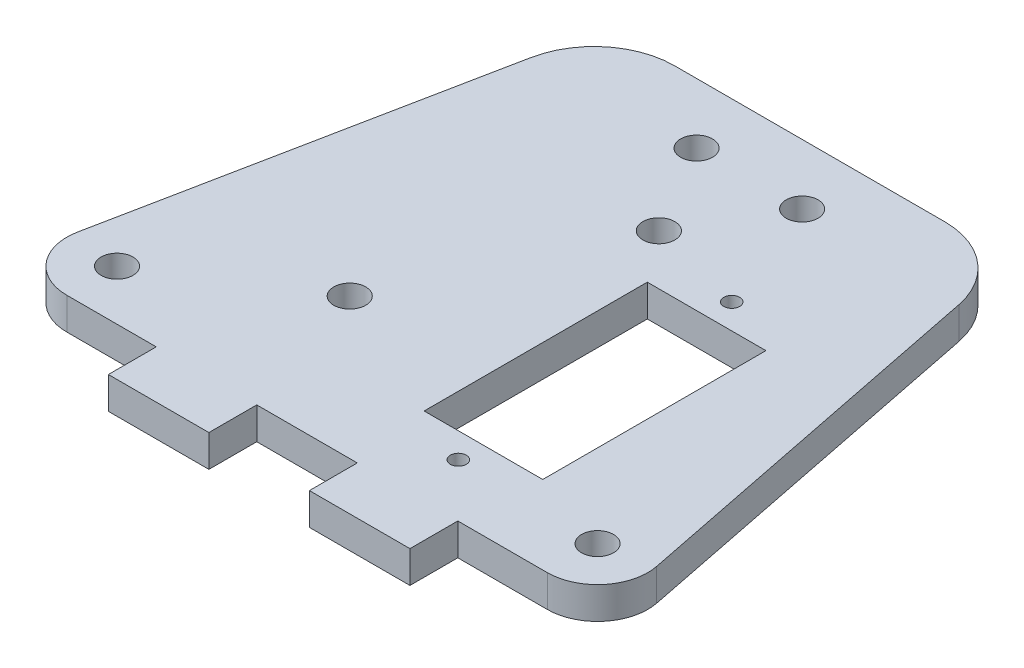
ISO-10303-21;
HEADER;
FILE_DESCRIPTION(('STEP AP214'),'2;1');
FILE_NAME('part.step','',(''),(''),'','','');
FILE_SCHEMA(('AUTOMOTIVE_DESIGN { 1 0 10303 214 1 1 1 1 }'));
ENDSEC;
DATA;
#1=APPLICATION_CONTEXT('core data for automotive mechanical design processes');
#2=APPLICATION_PROTOCOL_DEFINITION('international standard','automotive_design',2000,#1);
#3=PRODUCT_CONTEXT('',#1,'mechanical');
#4=PRODUCT('Part','Part','',(#3));
#5=PRODUCT_RELATED_PRODUCT_CATEGORY('part','',(#4));
#6=PRODUCT_DEFINITION_FORMATION('','',#4);
#7=PRODUCT_DEFINITION_CONTEXT('part definition',#1,'design');
#8=PRODUCT_DEFINITION('design','',#6,#7);
#9=PRODUCT_DEFINITION_SHAPE('','',#8);
#10=(LENGTH_UNIT() NAMED_UNIT(*) SI_UNIT(.MILLI.,.METRE.));
#11=(NAMED_UNIT(*) PLANE_ANGLE_UNIT() SI_UNIT($,.RADIAN.));
#12=(NAMED_UNIT(*) SI_UNIT($,.STERADIAN.) SOLID_ANGLE_UNIT());
#13=UNCERTAINTY_MEASURE_WITH_UNIT(LENGTH_MEASURE(1.E-05),#10,'distance_accuracy_value','');
#14=(GEOMETRIC_REPRESENTATION_CONTEXT(3) GLOBAL_UNCERTAINTY_ASSIGNED_CONTEXT((#13)) GLOBAL_UNIT_ASSIGNED_CONTEXT((#10,
#11,#12)) REPRESENTATION_CONTEXT('',''));
#15=CARTESIAN_POINT('',(0.,0.,0.));
#16=DIRECTION('',(0.,0.,1.));
#17=DIRECTION('',(1.,0.,0.));
#18=AXIS2_PLACEMENT_3D('',#15,#16,#17);
#19=CARTESIAN_POINT('',(0.,3.175,0.));
#20=DIRECTION('',(0.,0.,-1.));
#21=DIRECTION('',(-1.,0.,0.));
#22=AXIS2_PLACEMENT_3D('',#19,#20,#21);
#23=PLANE('',#22);
#24=DIRECTION('',(1.,0.,0.));
#25=VECTOR('',#24,1.);
#26=CARTESIAN_POINT('',(0.,0.,0.));
#27=LINE('',#26,#25);
#28=CARTESIAN_POINT('',(25.0000000000002,0.,0.));
#29=VERTEX_POINT('',#28);
#30=CARTESIAN_POINT('',(35.0000000000002,0.,0.));
#31=VERTEX_POINT('',#30);
#32=EDGE_CURVE('E365',#29,#31,#27,.T.);
#33=ORIENTED_EDGE('',*,*,#32,.T.);
#34=DIRECTION('',(0.,1.,0.));
#35=VECTOR('',#34,1.);
#36=CARTESIAN_POINT('',(35.0000000000002,0.,0.));
#37=LINE('',#36,#35);
#38=CARTESIAN_POINT('',(35.0000000000002,3.175,0.));
#39=VERTEX_POINT('',#38);
#40=EDGE_CURVE('E57',#31,#39,#37,.T.);
#41=ORIENTED_EDGE('',*,*,#40,.T.);
#42=DIRECTION('',(1.,0.,0.));
#43=VECTOR('',#42,1.);
#44=CARTESIAN_POINT('',(0.,3.175,0.));
#45=LINE('',#44,#43);
#46=CARTESIAN_POINT('',(25.0000000000002,3.175,0.));
#47=VERTEX_POINT('',#46);
#48=EDGE_CURVE('E350',#47,#39,#45,.T.);
#49=ORIENTED_EDGE('',*,*,#48,.F.);
#50=DIRECTION('',(0.,1.,0.));
#51=VECTOR('',#50,1.);
#52=CARTESIAN_POINT('',(25.0000000000002,0.,0.));
#53=LINE('',#52,#51);
#54=EDGE_CURVE('E230',#29,#47,#53,.T.);
#55=ORIENTED_EDGE('',*,*,#54,.F.);
#56=EDGE_LOOP('',(#33,#41,#49,#55));
#57=FACE_BOUND('',#56,.T.);
#58=ADVANCED_FACE('F34',(#57),#23,.F.);
#59=CARTESIAN_POINT('',(6.09901951359281,0.,0.));
#60=VERTEX_POINT('',#59);
#61=CARTESIAN_POINT('',(15.0000000000002,0.,0.));
#62=VERTEX_POINT('',#61);
#63=EDGE_CURVE('E363',#60,#62,#27,.T.);
#64=ORIENTED_EDGE('',*,*,#63,.T.);
#65=DIRECTION('',(0.,1.,0.));
#66=VECTOR('',#65,1.);
#67=CARTESIAN_POINT('',(15.0000000000002,0.,0.));
#68=LINE('',#67,#66);
#69=CARTESIAN_POINT('',(15.0000000000002,3.175,0.));
#70=VERTEX_POINT('',#69);
#71=EDGE_CURVE('E227',#62,#70,#68,.T.);
#72=ORIENTED_EDGE('',*,*,#71,.T.);
#73=CARTESIAN_POINT('',(6.09901951359281,3.175,0.));
#74=VERTEX_POINT('',#73);
#75=EDGE_CURVE('E346',#74,#70,#45,.T.);
#76=ORIENTED_EDGE('',*,*,#75,.F.);
#77=DIRECTION('',(0.,1.,0.));
#78=VECTOR('',#77,1.);
#79=CARTESIAN_POINT('',(6.09901951359281,0.,0.));
#80=LINE('',#79,#78);
#81=EDGE_CURVE('E251',#60,#74,#80,.T.);
#82=ORIENTED_EDGE('',*,*,#81,.F.);
#83=EDGE_LOOP('',(#64,#72,#76,#82));
#84=FACE_BOUND('',#83,.T.);
#85=ADVANCED_FACE('F420',(#84),#23,.F.);
#86=CARTESIAN_POINT('',(45.0000000000002,3.175,0.));
#87=VERTEX_POINT('',#86);
#88=CARTESIAN_POINT('',(53.9009804864072,3.175,0.));
#89=VERTEX_POINT('',#88);
#90=EDGE_CURVE('E49',#87,#89,#45,.T.);
#91=ORIENTED_EDGE('',*,*,#90,.F.);
#92=DIRECTION('',(0.,1.,0.));
#93=VECTOR('',#92,1.);
#94=CARTESIAN_POINT('',(45.0000000000002,0.,0.));
#95=LINE('',#94,#93);
#96=CARTESIAN_POINT('',(45.0000000000002,0.,0.));
#97=VERTEX_POINT('',#96);
#98=EDGE_CURVE('E206',#97,#87,#95,.T.);
#99=ORIENTED_EDGE('',*,*,#98,.F.);
#100=CARTESIAN_POINT('',(53.9009804864072,0.,0.));
#101=VERTEX_POINT('',#100);
#102=EDGE_CURVE('E362',#97,#101,#27,.T.);
#103=ORIENTED_EDGE('',*,*,#102,.T.);
#104=DIRECTION('',(0.,1.,0.));
#105=VECTOR('',#104,1.);
#106=CARTESIAN_POINT('',(53.9009804864072,0.,0.));
#107=LINE('',#106,#105);
#108=EDGE_CURVE('E239',#101,#89,#107,.T.);
#109=ORIENTED_EDGE('',*,*,#108,.T.);
#110=EDGE_LOOP('',(#91,#99,#103,#109));
#111=FACE_BOUND('',#110,.T.);
#112=ADVANCED_FACE('F436',(#111),#23,.F.);
#113=CARTESIAN_POINT('',(8.71378581622126,3.175,-43.5689290811055));
#114=DIRECTION('',(0.980580675690919,0.,0.196116135138188));
#115=DIRECTION('',(0.196116135138188,0.,-0.98058067569092));
#116=AXIS2_PLACEMENT_3D('',#113,#114,#115);
#117=PLANE('',#116);
#118=DIRECTION('',(0.,1.,0.));
#119=VECTOR('',#118,1.);
#120=CARTESIAN_POINT('',(1.19611613513821,0.,-5.98058067569094));
#121=LINE('',#120,#119);
#122=CARTESIAN_POINT('',(1.19611613513821,0.,-5.98058067569094));
#123=VERTEX_POINT('',#122);
#124=CARTESIAN_POINT('',(1.19611613513821,3.175,-5.98058067569094));
#125=VERTEX_POINT('',#124);
#126=EDGE_CURVE('E249',#123,#125,#121,.T.);
#127=ORIENTED_EDGE('',*,*,#126,.T.);
#128=DIRECTION('',(-0.196116135138188,0.,0.980580675690919));
#129=VECTOR('',#128,1.);
#130=CARTESIAN_POINT('',(8.71378581622126,3.175,-43.5689290811055));
#131=LINE('',#130,#129);
#132=CARTESIAN_POINT('',(8.71378581622126,3.175,-43.5689290811055));
#133=VERTEX_POINT('',#132);
#134=EDGE_CURVE('E343',#133,#125,#131,.T.);
#135=ORIENTED_EDGE('',*,*,#134,.F.);
#136=DIRECTION('',(0.,-1.,0.));
#137=VECTOR('',#136,1.);
#138=CARTESIAN_POINT('',(8.71378581622126,3.175,-43.5689290811055));
#139=LINE('',#138,#137);
#140=CARTESIAN_POINT('',(8.71378581622126,0.,-43.5689290811055));
#141=VERTEX_POINT('',#140);
#142=EDGE_CURVE('E369',#133,#141,#139,.T.);
#143=ORIENTED_EDGE('',*,*,#142,.T.);
#144=DIRECTION('',(-0.196116135138188,0.,0.980580675690919));
#145=VECTOR('',#144,1.);
#146=CARTESIAN_POINT('',(8.71378581622126,0.,-43.5689290811055));
#147=LINE('',#146,#145);
#148=EDGE_CURVE('E359',#141,#123,#147,.T.);
#149=ORIENTED_EDGE('',*,*,#148,.T.);
#150=EDGE_LOOP('',(#127,#135,#143,#149));
#151=FACE_BOUND('',#150,.T.);
#152=ADVANCED_FACE('F383',(#151),#117,.F.);
#153=CARTESIAN_POINT('',(43.4415687782517,3.175,-42.));
#154=DIRECTION('',(0.,1.,0.));
#155=DIRECTION('',(0.,0.,1.));
#156=AXIS2_PLACEMENT_3D('',#153,#154,#155);
#157=PLANE('',#156);
#158=CARTESIAN_POINT('',(53.9009804864072,3.175,-5.));
#159=DIRECTION('',(0.,-1.,0.));
#160=DIRECTION('',(0.,0.,1.));
#161=AXIS2_PLACEMENT_3D('',#158,#159,#160);
#162=CIRCLE('',#161,5.);
#163=CARTESIAN_POINT('',(58.8038838648618,3.175,-5.9805806756909));
#164=VERTEX_POINT('',#163);
#165=EDGE_CURVE('E229',#164,#89,#162,.T.);
#166=ORIENTED_EDGE('',*,*,#165,.F.);
#167=DIRECTION('',(-0.19611613513818,0.,-0.980580675690921));
#168=VECTOR('',#167,1.);
#169=CARTESIAN_POINT('',(51.2862141837791,3.175,-43.5689290811054));
#170=LINE('',#169,#168);
#171=CARTESIAN_POINT('',(51.2862141837791,3.175,-43.5689290811054));
#172=VERTEX_POINT('',#171);
#173=EDGE_CURVE('E349',#164,#172,#170,.T.);
#174=ORIENTED_EDGE('',*,*,#173,.T.);
#175=CARTESIAN_POINT('',(43.4415687782517,3.175,-42.));
#176=DIRECTION('',(0.,1.,0.));
#177=DIRECTION('',(0.,0.,1.));
#178=AXIS2_PLACEMENT_3D('',#175,#176,#177);
#179=CIRCLE('',#178,8.);
#180=CARTESIAN_POINT('',(43.4415687782517,3.175,-50.));
#181=VERTEX_POINT('',#180);
#182=EDGE_CURVE('E335',#172,#181,#179,.T.);
#183=ORIENTED_EDGE('',*,*,#182,.T.);
#184=DIRECTION('',(-1.,0.,0.));
#185=VECTOR('',#184,1.);
#186=CARTESIAN_POINT('',(16.5584312217487,3.175,-50.));
#187=LINE('',#186,#185);
#188=CARTESIAN_POINT('',(16.5584312217487,3.175,-50.));
#189=VERTEX_POINT('',#188);
#190=EDGE_CURVE('E338',#181,#189,#187,.T.);
#191=ORIENTED_EDGE('',*,*,#190,.T.);
#192=CARTESIAN_POINT('',(16.5584312217486,3.175,-42.));
#193=DIRECTION('',(0.,1.,0.));
#194=DIRECTION('',(0.,0.,-1.));
#195=AXIS2_PLACEMENT_3D('',#192,#193,#194);
#196=CIRCLE('',#195,8.);
#197=EDGE_CURVE('E341',#189,#133,#196,.T.);
#198=ORIENTED_EDGE('',*,*,#197,.T.);
#199=ORIENTED_EDGE('',*,*,#134,.T.);
#200=CARTESIAN_POINT('',(6.09901951359281,3.175,-5.));
#201=DIRECTION('',(0.,-1.,0.));
#202=DIRECTION('',(0.,0.,1.));
#203=AXIS2_PLACEMENT_3D('',#200,#201,#202);
#204=CIRCLE('',#203,5.);
#205=EDGE_CURVE('E244',#74,#125,#204,.T.);
#206=ORIENTED_EDGE('',*,*,#205,.F.);
#207=ORIENTED_EDGE('',*,*,#75,.T.);
#208=DIRECTION('',(0.,0.,1.));
#209=VECTOR('',#208,1.);
#210=CARTESIAN_POINT('',(15.0000000000002,3.175,0.));
#211=LINE('',#210,#209);
#212=CARTESIAN_POINT('',(15.0000000000002,3.175,4.7625));
#213=VERTEX_POINT('',#212);
#214=EDGE_CURVE('E205',#70,#213,#211,.T.);
#215=ORIENTED_EDGE('',*,*,#214,.T.);
#216=DIRECTION('',(1.,0.,0.));
#217=VECTOR('',#216,1.);
#218=CARTESIAN_POINT('',(15.0000000000002,3.175,4.7625));
#219=LINE('',#218,#217);
#220=CARTESIAN_POINT('',(25.0000000000002,3.175,4.7625));
#221=VERTEX_POINT('',#220);
#222=EDGE_CURVE('E222',#213,#221,#219,.T.);
#223=ORIENTED_EDGE('',*,*,#222,.T.);
#224=DIRECTION('',(0.,0.,-1.));
#225=VECTOR('',#224,1.);
#226=CARTESIAN_POINT('',(25.0000000000002,3.175,0.));
#227=LINE('',#226,#225);
#228=EDGE_CURVE('E213',#221,#47,#227,.T.);
#229=ORIENTED_EDGE('',*,*,#228,.T.);
#230=ORIENTED_EDGE('',*,*,#48,.T.);
#231=DIRECTION('',(0.,0.,1.));
#232=VECTOR('',#231,1.);
#233=CARTESIAN_POINT('',(35.0000000000002,3.175,0.));
#234=LINE('',#233,#232);
#235=CARTESIAN_POINT('',(35.0000000000002,3.175,4.7625));
#236=VERTEX_POINT('',#235);
#237=EDGE_CURVE('E201',#39,#236,#234,.T.);
#238=ORIENTED_EDGE('',*,*,#237,.T.);
#239=DIRECTION('',(1.,0.,0.));
#240=VECTOR('',#239,1.);
#241=CARTESIAN_POINT('',(35.0000000000002,3.175,4.7625));
#242=LINE('',#241,#240);
#243=CARTESIAN_POINT('',(45.0000000000002,3.175,4.7625));
#244=VERTEX_POINT('',#243);
#245=EDGE_CURVE('E177',#236,#244,#242,.T.);
#246=ORIENTED_EDGE('',*,*,#245,.T.);
#247=DIRECTION('',(0.,0.,-1.));
#248=VECTOR('',#247,1.);
#249=CARTESIAN_POINT('',(45.0000000000002,3.175,0.));
#250=LINE('',#249,#248);
#251=EDGE_CURVE('E195',#244,#87,#250,.T.);
#252=ORIENTED_EDGE('',*,*,#251,.T.);
#253=ORIENTED_EDGE('',*,*,#90,.T.);
#254=EDGE_LOOP('',(#166,#174,#183,#191,#198,#199,#206,#207,#215,#223,#229,#230,#238,#246,#252,#253));
#255=FACE_BOUND('',#254,.T.);
#256=CARTESIAN_POINT('',(53.9009804864072,3.175,-5.));
#257=DIRECTION('',(0.,1.,0.));
#258=DIRECTION('',(0.,0.,1.));
#259=AXIS2_PLACEMENT_3D('',#256,#257,#258);
#260=CIRCLE('',#259,1.5875);
#261=CARTESIAN_POINT('',(53.9009804864072,3.175,-3.4125));
#262=VERTEX_POINT('',#261);
#263=EDGE_CURVE('E253',#262,#262,#260,.T.);
#264=ORIENTED_EDGE('',*,*,#263,.F.);
#265=EDGE_LOOP('',(#264));
#266=FACE_BOUND('',#265,.T.);
#267=CARTESIAN_POINT('',(6.09901951359281,3.175,-5.));
#268=DIRECTION('',(0.,1.,0.));
#269=DIRECTION('',(0.,0.,1.));
#270=AXIS2_PLACEMENT_3D('',#267,#268,#269);
#271=CIRCLE('',#270,1.5875);
#272=CARTESIAN_POINT('',(6.09901951359281,3.175,-3.4125));
#273=VERTEX_POINT('',#272);
#274=EDGE_CURVE('E259',#273,#273,#271,.T.);
#275=ORIENTED_EDGE('',*,*,#274,.F.);
#276=EDGE_LOOP('',(#275));
#277=FACE_BOUND('',#276,.T.);
#278=CARTESIAN_POINT('',(30.,3.175,-35.));
#279=DIRECTION('',(0.,1.,0.));
#280=DIRECTION('',(0.,0.,1.));
#281=AXIS2_PLACEMENT_3D('',#278,#279,#280);
#282=CIRCLE('',#281,1.5875);
#283=CARTESIAN_POINT('',(30.,3.175,-33.4125));
#284=VERTEX_POINT('',#283);
#285=EDGE_CURVE('E265',#284,#284,#282,.T.);
#286=ORIENTED_EDGE('',*,*,#285,.F.);
#287=EDGE_LOOP('',(#286));
#288=FACE_BOUND('',#287,.T.);
#289=CARTESIAN_POINT('',(24.75,3.175,-44.));
#290=DIRECTION('',(0.,1.,0.));
#291=DIRECTION('',(0.,0.,1.));
#292=AXIS2_PLACEMENT_3D('',#289,#290,#291);
#293=CIRCLE('',#292,1.5875);
#294=CARTESIAN_POINT('',(24.75,3.175,-42.4125));
#295=VERTEX_POINT('',#294);
#296=EDGE_CURVE('E280',#295,#295,#293,.T.);
#297=ORIENTED_EDGE('',*,*,#296,.F.);
#298=EDGE_LOOP('',(#297));
#299=FACE_BOUND('',#298,.T.);
#300=CARTESIAN_POINT('',(39.75,3.175,-32.5));
#301=DIRECTION('',(0.,1.,0.));
#302=DIRECTION('',(0.,0.,1.));
#303=AXIS2_PLACEMENT_3D('',#300,#301,#302);
#304=CIRCLE('',#303,0.793749999999999);
#305=CARTESIAN_POINT('',(39.75,3.175,-31.70625));
#306=VERTEX_POINT('',#305);
#307=EDGE_CURVE('E292',#306,#306,#304,.T.);
#308=ORIENTED_EDGE('',*,*,#307,.F.);
#309=EDGE_LOOP('',(#308));
#310=FACE_BOUND('',#309,.T.);
#311=DIRECTION('',(1.,0.,0.));
#312=VECTOR('',#311,1.);
#313=CARTESIAN_POINT('',(45.65,3.175,-7.79999999999999));
#314=LINE('',#313,#312);
#315=CARTESIAN_POINT('',(33.85,3.175,-7.79999999999999));
#316=VERTEX_POINT('',#315);
#317=CARTESIAN_POINT('',(45.65,3.175,-7.79999999999999));
#318=VERTEX_POINT('',#317);
#319=EDGE_CURVE('E306',#316,#318,#314,.T.);
#320=ORIENTED_EDGE('',*,*,#319,.F.);
#321=DIRECTION('',(0.,0.,1.));
#322=VECTOR('',#321,1.);
#323=CARTESIAN_POINT('',(33.85,3.175,-30.));
#324=LINE('',#323,#322);
#325=CARTESIAN_POINT('',(33.85,3.175,-30.));
#326=VERTEX_POINT('',#325);
#327=EDGE_CURVE('E304',#326,#316,#324,.T.);
#328=ORIENTED_EDGE('',*,*,#327,.F.);
#329=DIRECTION('',(-1.,0.,0.));
#330=VECTOR('',#329,1.);
#331=CARTESIAN_POINT('',(33.85,3.175,-30.));
#332=LINE('',#331,#330);
#333=CARTESIAN_POINT('',(45.65,3.175,-30.));
#334=VERTEX_POINT('',#333);
#335=EDGE_CURVE('E312',#334,#326,#332,.T.);
#336=ORIENTED_EDGE('',*,*,#335,.F.);
#337=DIRECTION('',(0.,0.,-1.));
#338=VECTOR('',#337,1.);
#339=CARTESIAN_POINT('',(45.65,3.175,-30.));
#340=LINE('',#339,#338);
#341=EDGE_CURVE('E309',#318,#334,#340,.T.);
#342=ORIENTED_EDGE('',*,*,#341,.F.);
#343=EDGE_LOOP('',(#320,#328,#336,#342));
#344=FACE_BOUND('',#343,.T.);
#345=CARTESIAN_POINT('',(39.75,3.175,-5.29999999999999));
#346=DIRECTION('',(0.,1.,0.));
#347=DIRECTION('',(0.,0.,1.));
#348=AXIS2_PLACEMENT_3D('',#345,#346,#347);
#349=CIRCLE('',#348,0.79375);
#350=CARTESIAN_POINT('',(39.75,3.175,-4.50624999999999));
#351=VERTEX_POINT('',#350);
#352=EDGE_CURVE('E298',#351,#351,#349,.T.);
#353=ORIENTED_EDGE('',*,*,#352,.F.);
#354=EDGE_LOOP('',(#353));
#355=FACE_BOUND('',#354,.T.);
#356=CARTESIAN_POINT('',(20.25,3.175,-14.));
#357=DIRECTION('',(0.,1.,0.));
#358=DIRECTION('',(0.,0.,1.));
#359=AXIS2_PLACEMENT_3D('',#356,#357,#358);
#360=CIRCLE('',#359,1.5875);
#361=CARTESIAN_POINT('',(20.25,3.175,-12.4125));
#362=VERTEX_POINT('',#361);
#363=EDGE_CURVE('E286',#362,#362,#360,.T.);
#364=ORIENTED_EDGE('',*,*,#363,.F.);
#365=EDGE_LOOP('',(#364));
#366=FACE_BOUND('',#365,.T.);
#367=CARTESIAN_POINT('',(35.25,3.175,-44.));
#368=DIRECTION('',(0.,1.,0.));
#369=DIRECTION('',(0.,0.,1.));
#370=AXIS2_PLACEMENT_3D('',#367,#368,#369);
#371=CIRCLE('',#370,1.5875);
#372=CARTESIAN_POINT('',(35.25,3.175,-42.4125));
#373=VERTEX_POINT('',#372);
#374=EDGE_CURVE('E274',#373,#373,#371,.T.);
#375=ORIENTED_EDGE('',*,*,#374,.F.);
#376=EDGE_LOOP('',(#375));
#377=FACE_BOUND('',#376,.T.);
#378=ADVANCED_FACE('F388',(#255,#266,#277,#288,#299,#310,#344,#355,#366,#377),#157,.T.);
#379=CARTESIAN_POINT('',(43.4415687782517,0.,-42.));
#380=DIRECTION('',(0.,1.,0.));
#381=DIRECTION('',(0.,0.,1.));
#382=AXIS2_PLACEMENT_3D('',#379,#380,#381);
#383=PLANE('',#382);
#384=CARTESIAN_POINT('',(53.9009804864072,0.,-5.));
#385=DIRECTION('',(0.,1.,0.));
#386=DIRECTION('',(0.,0.,1.));
#387=AXIS2_PLACEMENT_3D('',#384,#385,#386);
#388=CIRCLE('',#387,1.5875);
#389=CARTESIAN_POINT('',(53.9009804864072,0.,-3.4125));
#390=VERTEX_POINT('',#389);
#391=EDGE_CURVE('E256',#390,#390,#388,.T.);
#392=ORIENTED_EDGE('',*,*,#391,.T.);
#393=EDGE_LOOP('',(#392));
#394=FACE_BOUND('',#393,.T.);
#395=CARTESIAN_POINT('',(6.09901951359281,0.,-5.));
#396=DIRECTION('',(0.,1.,0.));
#397=DIRECTION('',(0.,0.,1.));
#398=AXIS2_PLACEMENT_3D('',#395,#396,#397);
#399=CIRCLE('',#398,1.5875);
#400=CARTESIAN_POINT('',(6.09901951359281,0.,-3.4125));
#401=VERTEX_POINT('',#400);
#402=EDGE_CURVE('E262',#401,#401,#399,.T.);
#403=ORIENTED_EDGE('',*,*,#402,.T.);
#404=EDGE_LOOP('',(#403));
#405=FACE_BOUND('',#404,.T.);
#406=CARTESIAN_POINT('',(30.,0.,-35.));
#407=DIRECTION('',(0.,1.,0.));
#408=DIRECTION('',(0.,0.,1.));
#409=AXIS2_PLACEMENT_3D('',#406,#407,#408);
#410=CIRCLE('',#409,1.5875);
#411=CARTESIAN_POINT('',(30.,0.,-33.4125));
#412=VERTEX_POINT('',#411);
#413=EDGE_CURVE('E268',#412,#412,#410,.T.);
#414=ORIENTED_EDGE('',*,*,#413,.T.);
#415=EDGE_LOOP('',(#414));
#416=FACE_BOUND('',#415,.T.);
#417=CARTESIAN_POINT('',(24.75,0.,-44.));
#418=DIRECTION('',(0.,1.,0.));
#419=DIRECTION('',(0.,0.,1.));
#420=AXIS2_PLACEMENT_3D('',#417,#418,#419);
#421=CIRCLE('',#420,1.5875);
#422=CARTESIAN_POINT('',(24.75,0.,-42.4125));
#423=VERTEX_POINT('',#422);
#424=EDGE_CURVE('E277',#423,#423,#421,.T.);
#425=ORIENTED_EDGE('',*,*,#424,.T.);
#426=EDGE_LOOP('',(#425));
#427=FACE_BOUND('',#426,.T.);
#428=CARTESIAN_POINT('',(39.75,0.,-32.5));
#429=DIRECTION('',(0.,1.,0.));
#430=DIRECTION('',(0.,0.,1.));
#431=AXIS2_PLACEMENT_3D('',#428,#429,#430);
#432=CIRCLE('',#431,0.793749999999999);
#433=CARTESIAN_POINT('',(39.75,0.,-31.70625));
#434=VERTEX_POINT('',#433);
#435=EDGE_CURVE('E289',#434,#434,#432,.T.);
#436=ORIENTED_EDGE('',*,*,#435,.T.);
#437=EDGE_LOOP('',(#436));
#438=FACE_BOUND('',#437,.T.);
#439=DIRECTION('',(0.,0.,1.));
#440=VECTOR('',#439,1.);
#441=CARTESIAN_POINT('',(33.85,0.,-30.));
#442=LINE('',#441,#440);
#443=CARTESIAN_POINT('',(33.85,0.,-30.));
#444=VERTEX_POINT('',#443);
#445=CARTESIAN_POINT('',(33.85,0.,-7.79999999999999));
#446=VERTEX_POINT('',#445);
#447=EDGE_CURVE('E301',#444,#446,#442,.T.);
#448=ORIENTED_EDGE('',*,*,#447,.T.);
#449=DIRECTION('',(1.,0.,0.));
#450=VECTOR('',#449,1.);
#451=CARTESIAN_POINT('',(45.65,0.,-7.79999999999999));
#452=LINE('',#451,#450);
#453=CARTESIAN_POINT('',(45.65,0.,-7.79999999999999));
#454=VERTEX_POINT('',#453);
#455=EDGE_CURVE('E317',#446,#454,#452,.T.);
#456=ORIENTED_EDGE('',*,*,#455,.T.);
#457=DIRECTION('',(0.,0.,-1.));
#458=VECTOR('',#457,1.);
#459=CARTESIAN_POINT('',(45.65,0.,-30.));
#460=LINE('',#459,#458);
#461=CARTESIAN_POINT('',(45.65,0.,-30.));
#462=VERTEX_POINT('',#461);
#463=EDGE_CURVE('E320',#454,#462,#460,.T.);
#464=ORIENTED_EDGE('',*,*,#463,.T.);
#465=DIRECTION('',(-1.,0.,0.));
#466=VECTOR('',#465,1.);
#467=CARTESIAN_POINT('',(33.85,0.,-30.));
#468=LINE('',#467,#466);
#469=EDGE_CURVE('E307',#462,#444,#468,.T.);
#470=ORIENTED_EDGE('',*,*,#469,.T.);
#471=EDGE_LOOP('',(#448,#456,#464,#470));
#472=FACE_BOUND('',#471,.T.);
#473=DIRECTION('',(-0.19611613513818,0.,-0.980580675690921));
#474=VECTOR('',#473,1.);
#475=CARTESIAN_POINT('',(51.2862141837791,0.,-43.5689290811054));
#476=LINE('',#475,#474);
#477=CARTESIAN_POINT('',(58.8038838648618,0.,-5.98058067569091));
#478=VERTEX_POINT('',#477);
#479=CARTESIAN_POINT('',(51.2862141837791,0.,-43.5689290811054));
#480=VERTEX_POINT('',#479);
#481=EDGE_CURVE('E339',#478,#480,#476,.T.);
#482=ORIENTED_EDGE('',*,*,#481,.F.);
#483=CARTESIAN_POINT('',(53.9009804864072,0.,-5.));
#484=DIRECTION('',(0.,-1.,0.));
#485=DIRECTION('',(0.,0.,1.));
#486=AXIS2_PLACEMENT_3D('',#483,#484,#485);
#487=CIRCLE('',#486,5.);
#488=EDGE_CURVE('E236',#478,#101,#487,.T.);
#489=ORIENTED_EDGE('',*,*,#488,.T.);
#490=ORIENTED_EDGE('',*,*,#102,.F.);
#491=DIRECTION('',(0.,0.,-1.));
#492=VECTOR('',#491,1.);
#493=CARTESIAN_POINT('',(45.0000000000002,0.,0.));
#494=LINE('',#493,#492);
#495=CARTESIAN_POINT('',(45.0000000000002,0.,4.7625));
#496=VERTEX_POINT('',#495);
#497=EDGE_CURVE('E183',#496,#97,#494,.T.);
#498=ORIENTED_EDGE('',*,*,#497,.F.);
#499=DIRECTION('',(1.,0.,0.));
#500=VECTOR('',#499,1.);
#501=CARTESIAN_POINT('',(35.0000000000002,0.,4.7625));
#502=LINE('',#501,#500);
#503=CARTESIAN_POINT('',(35.0000000000002,0.,4.7625));
#504=VERTEX_POINT('',#503);
#505=EDGE_CURVE('E175',#504,#496,#502,.T.);
#506=ORIENTED_EDGE('',*,*,#505,.F.);
#507=DIRECTION('',(0.,0.,1.));
#508=VECTOR('',#507,1.);
#509=CARTESIAN_POINT('',(35.0000000000002,0.,0.));
#510=LINE('',#509,#508);
#511=EDGE_CURVE('E191',#31,#504,#510,.T.);
#512=ORIENTED_EDGE('',*,*,#511,.F.);
#513=ORIENTED_EDGE('',*,*,#32,.F.);
#514=DIRECTION('',(0.,0.,-1.));
#515=VECTOR('',#514,1.);
#516=CARTESIAN_POINT('',(25.0000000000002,0.,0.));
#517=LINE('',#516,#515);
#518=CARTESIAN_POINT('',(25.0000000000002,0.,4.7625));
#519=VERTEX_POINT('',#518);
#520=EDGE_CURVE('E216',#519,#29,#517,.T.);
#521=ORIENTED_EDGE('',*,*,#520,.F.);
#522=DIRECTION('',(1.,0.,0.));
#523=VECTOR('',#522,1.);
#524=CARTESIAN_POINT('',(15.0000000000002,0.,4.7625));
#525=LINE('',#524,#523);
#526=CARTESIAN_POINT('',(15.0000000000002,0.,4.7625));
#527=VERTEX_POINT('',#526);
#528=EDGE_CURVE('E212',#527,#519,#525,.T.);
#529=ORIENTED_EDGE('',*,*,#528,.F.);
#530=DIRECTION('',(0.,0.,1.));
#531=VECTOR('',#530,1.);
#532=CARTESIAN_POINT('',(15.0000000000002,0.,0.));
#533=LINE('',#532,#531);
#534=EDGE_CURVE('E209',#62,#527,#533,.T.);
#535=ORIENTED_EDGE('',*,*,#534,.F.);
#536=ORIENTED_EDGE('',*,*,#63,.F.);
#537=CARTESIAN_POINT('',(6.09901951359281,0.,-5.));
#538=DIRECTION('',(0.,-1.,0.));
#539=DIRECTION('',(0.,0.,1.));
#540=AXIS2_PLACEMENT_3D('',#537,#538,#539);
#541=CIRCLE('',#540,5.);
#542=EDGE_CURVE('E246',#60,#123,#541,.T.);
#543=ORIENTED_EDGE('',*,*,#542,.T.);
#544=ORIENTED_EDGE('',*,*,#148,.F.);
#545=CARTESIAN_POINT('',(16.5584312217486,0.,-42.));
#546=DIRECTION('',(0.,1.,0.));
#547=DIRECTION('',(0.,0.,-1.));
#548=AXIS2_PLACEMENT_3D('',#545,#546,#547);
#549=CIRCLE('',#548,8.);
#550=CARTESIAN_POINT('',(16.5584312217487,0.,-50.));
#551=VERTEX_POINT('',#550);
#552=EDGE_CURVE('E357',#551,#141,#549,.T.);
#553=ORIENTED_EDGE('',*,*,#552,.F.);
#554=DIRECTION('',(-1.,0.,0.));
#555=VECTOR('',#554,1.);
#556=CARTESIAN_POINT('',(16.5584312217487,0.,-50.));
#557=LINE('',#556,#555);
#558=CARTESIAN_POINT('',(43.4415687782517,0.,-50.));
#559=VERTEX_POINT('',#558);
#560=EDGE_CURVE('E355',#559,#551,#557,.T.);
#561=ORIENTED_EDGE('',*,*,#560,.F.);
#562=CARTESIAN_POINT('',(43.4415687782517,0.,-42.));
#563=DIRECTION('',(0.,1.,0.));
#564=DIRECTION('',(0.,0.,1.));
#565=AXIS2_PLACEMENT_3D('',#562,#563,#564);
#566=CIRCLE('',#565,8.);
#567=EDGE_CURVE('E334',#480,#559,#566,.T.);
#568=ORIENTED_EDGE('',*,*,#567,.F.);
#569=EDGE_LOOP('',(#482,#489,#490,#498,#506,#512,#513,#521,#529,#535,#536,#543,#544,#553,#561,#568));
#570=FACE_BOUND('',#569,.T.);
#571=CARTESIAN_POINT('',(39.75,0.,-5.29999999999999));
#572=DIRECTION('',(0.,1.,0.));
#573=DIRECTION('',(0.,0.,1.));
#574=AXIS2_PLACEMENT_3D('',#571,#572,#573);
#575=CIRCLE('',#574,0.79375);
#576=CARTESIAN_POINT('',(39.75,0.,-4.50624999999999));
#577=VERTEX_POINT('',#576);
#578=EDGE_CURVE('E295',#577,#577,#575,.T.);
#579=ORIENTED_EDGE('',*,*,#578,.T.);
#580=EDGE_LOOP('',(#579));
#581=FACE_BOUND('',#580,.T.);
#582=CARTESIAN_POINT('',(20.25,0.,-14.));
#583=DIRECTION('',(0.,1.,0.));
#584=DIRECTION('',(0.,0.,1.));
#585=AXIS2_PLACEMENT_3D('',#582,#583,#584);
#586=CIRCLE('',#585,1.5875);
#587=CARTESIAN_POINT('',(20.25,0.,-12.4125));
#588=VERTEX_POINT('',#587);
#589=EDGE_CURVE('E283',#588,#588,#586,.T.);
#590=ORIENTED_EDGE('',*,*,#589,.T.);
#591=EDGE_LOOP('',(#590));
#592=FACE_BOUND('',#591,.T.);
#593=CARTESIAN_POINT('',(35.25,0.,-44.));
#594=DIRECTION('',(0.,1.,0.));
#595=DIRECTION('',(0.,0.,1.));
#596=AXIS2_PLACEMENT_3D('',#593,#594,#595);
#597=CIRCLE('',#596,1.5875);
#598=CARTESIAN_POINT('',(35.25,0.,-42.4125));
#599=VERTEX_POINT('',#598);
#600=EDGE_CURVE('E271',#599,#599,#597,.T.);
#601=ORIENTED_EDGE('',*,*,#600,.T.);
#602=EDGE_LOOP('',(#601));
#603=FACE_BOUND('',#602,.T.);
#604=ADVANCED_FACE('F189',(#394,#405,#416,#427,#438,#472,#570,#581,#592,#603),#383,.F.);
#605=CARTESIAN_POINT('',(43.4415687782517,3.175,-42.));
#606=DIRECTION('',(0.,-1.,0.));
#607=DIRECTION('',(0.,0.,-1.));
#608=AXIS2_PLACEMENT_3D('',#605,#606,#607);
#609=CYLINDRICAL_SURFACE('',#608,8.);
#610=ORIENTED_EDGE('',*,*,#567,.T.);
#611=DIRECTION('',(0.,-1.,0.));
#612=VECTOR('',#611,1.);
#613=CARTESIAN_POINT('',(43.4415687782517,3.175,-50.));
#614=LINE('',#613,#612);
#615=EDGE_CURVE('E11',#181,#559,#614,.T.);
#616=ORIENTED_EDGE('',*,*,#615,.F.);
#617=ORIENTED_EDGE('',*,*,#182,.F.);
#618=DIRECTION('',(0.,-1.,0.));
#619=VECTOR('',#618,1.);
#620=CARTESIAN_POINT('',(51.2862141837791,3.175,-43.5689290811054));
#621=LINE('',#620,#619);
#622=EDGE_CURVE('E352',#172,#480,#621,.T.);
#623=ORIENTED_EDGE('',*,*,#622,.T.);
#624=EDGE_LOOP('',(#610,#616,#617,#623));
#625=FACE_BOUND('',#624,.T.);
#626=ADVANCED_FACE('F36',(#625),#609,.T.);
#627=CARTESIAN_POINT('',(16.5584312217487,3.175,-50.));
#628=DIRECTION('',(0.,0.,1.));
#629=DIRECTION('',(1.,0.,0.));
#630=AXIS2_PLACEMENT_3D('',#627,#628,#629);
#631=PLANE('',#630);
#632=ORIENTED_EDGE('',*,*,#560,.T.);
#633=DIRECTION('',(0.,-1.,0.));
#634=VECTOR('',#633,1.);
#635=CARTESIAN_POINT('',(16.5584312217487,3.175,-50.));
#636=LINE('',#635,#634);
#637=EDGE_CURVE('E42',#189,#551,#636,.T.);
#638=ORIENTED_EDGE('',*,*,#637,.F.);
#639=ORIENTED_EDGE('',*,*,#190,.F.);
#640=ORIENTED_EDGE('',*,*,#615,.T.);
#641=EDGE_LOOP('',(#632,#638,#639,#640));
#642=FACE_BOUND('',#641,.T.);
#643=ADVANCED_FACE('F393',(#642),#631,.F.);
#644=CARTESIAN_POINT('',(16.5584312217486,3.175,-42.));
#645=DIRECTION('',(0.,-1.,0.));
#646=DIRECTION('',(0.,0.,-1.));
#647=AXIS2_PLACEMENT_3D('',#644,#645,#646);
#648=CYLINDRICAL_SURFACE('',#647,8.);
#649=ORIENTED_EDGE('',*,*,#552,.T.);
#650=ORIENTED_EDGE('',*,*,#142,.F.);
#651=ORIENTED_EDGE('',*,*,#197,.F.);
#652=ORIENTED_EDGE('',*,*,#637,.T.);
#653=EDGE_LOOP('',(#649,#650,#651,#652));
#654=FACE_BOUND('',#653,.T.);
#655=ADVANCED_FACE('F376',(#654),#648,.T.);
#656=CARTESIAN_POINT('',(51.2862141837791,3.175,-43.5689290811054));
#657=DIRECTION('',(-0.980580675690921,0.,0.19611613513818));
#658=DIRECTION('',(0.19611613513818,0.,0.980580675690921));
#659=AXIS2_PLACEMENT_3D('',#656,#657,#658);
#660=PLANE('',#659);
#661=ORIENTED_EDGE('',*,*,#173,.F.);
#662=DIRECTION('',(0.,1.,0.));
#663=VECTOR('',#662,1.);
#664=CARTESIAN_POINT('',(58.8038838648618,0.,-5.9805806756909));
#665=LINE('',#664,#663);
#666=EDGE_CURVE('E242',#478,#164,#665,.T.);
#667=ORIENTED_EDGE('',*,*,#666,.F.);
#668=ORIENTED_EDGE('',*,*,#481,.T.);
#669=ORIENTED_EDGE('',*,*,#622,.F.);
#670=EDGE_LOOP('',(#661,#667,#668,#669));
#671=FACE_BOUND('',#670,.T.);
#672=ADVANCED_FACE('F399',(#671),#660,.F.);
#673=CARTESIAN_POINT('',(33.85,3.175,-30.));
#674=DIRECTION('',(1.,0.,0.));
#675=DIRECTION('',(0.,0.,-1.));
#676=AXIS2_PLACEMENT_3D('',#673,#674,#675);
#677=PLANE('',#676);
#678=ORIENTED_EDGE('',*,*,#447,.F.);
#679=DIRECTION('',(0.,-1.,0.));
#680=VECTOR('',#679,1.);
#681=CARTESIAN_POINT('',(33.85,3.175,-30.));
#682=LINE('',#681,#680);
#683=EDGE_CURVE('E314',#326,#444,#682,.T.);
#684=ORIENTED_EDGE('',*,*,#683,.F.);
#685=ORIENTED_EDGE('',*,*,#327,.T.);
#686=DIRECTION('',(0.,-1.,0.));
#687=VECTOR('',#686,1.);
#688=CARTESIAN_POINT('',(33.85,3.175,-7.79999999999999));
#689=LINE('',#688,#687);
#690=EDGE_CURVE('E331',#316,#446,#689,.T.);
#691=ORIENTED_EDGE('',*,*,#690,.T.);
#692=EDGE_LOOP('',(#678,#684,#685,#691));
#693=FACE_BOUND('',#692,.T.);
#694=ADVANCED_FACE('F466',(#693),#677,.T.);
#695=CARTESIAN_POINT('',(45.65,3.175,-7.79999999999999));
#696=DIRECTION('',(0.,0.,-1.));
#697=DIRECTION('',(-1.,0.,0.));
#698=AXIS2_PLACEMENT_3D('',#695,#696,#697);
#699=PLANE('',#698);
#700=ORIENTED_EDGE('',*,*,#455,.F.);
#701=ORIENTED_EDGE('',*,*,#690,.F.);
#702=ORIENTED_EDGE('',*,*,#319,.T.);
#703=DIRECTION('',(0.,-1.,0.));
#704=VECTOR('',#703,1.);
#705=CARTESIAN_POINT('',(45.65,3.175,-7.79999999999999));
#706=LINE('',#705,#704);
#707=EDGE_CURVE('E329',#318,#454,#706,.T.);
#708=ORIENTED_EDGE('',*,*,#707,.T.);
#709=EDGE_LOOP('',(#700,#701,#702,#708));
#710=FACE_BOUND('',#709,.T.);
#711=ADVANCED_FACE('F470',(#710),#699,.T.);
#712=CARTESIAN_POINT('',(45.65,3.175,-30.));
#713=DIRECTION('',(-1.,0.,0.));
#714=DIRECTION('',(0.,0.,1.));
#715=AXIS2_PLACEMENT_3D('',#712,#713,#714);
#716=PLANE('',#715);
#717=ORIENTED_EDGE('',*,*,#463,.F.);
#718=ORIENTED_EDGE('',*,*,#707,.F.);
#719=ORIENTED_EDGE('',*,*,#341,.T.);
#720=DIRECTION('',(0.,-1.,0.));
#721=VECTOR('',#720,1.);
#722=CARTESIAN_POINT('',(45.65,3.175,-30.));
#723=LINE('',#722,#721);
#724=EDGE_CURVE('E327',#334,#462,#723,.T.);
#725=ORIENTED_EDGE('',*,*,#724,.T.);
#726=EDGE_LOOP('',(#717,#718,#719,#725));
#727=FACE_BOUND('',#726,.T.);
#728=ADVANCED_FACE('F475',(#727),#716,.T.);
#729=CARTESIAN_POINT('',(33.85,3.175,-30.));
#730=DIRECTION('',(0.,0.,1.));
#731=DIRECTION('',(1.,0.,0.));
#732=AXIS2_PLACEMENT_3D('',#729,#730,#731);
#733=PLANE('',#732);
#734=ORIENTED_EDGE('',*,*,#469,.F.);
#735=ORIENTED_EDGE('',*,*,#724,.F.);
#736=ORIENTED_EDGE('',*,*,#335,.T.);
#737=ORIENTED_EDGE('',*,*,#683,.T.);
#738=EDGE_LOOP('',(#734,#735,#736,#737));
#739=FACE_BOUND('',#738,.T.);
#740=ADVANCED_FACE('F481',(#739),#733,.T.);
#741=CARTESIAN_POINT('',(39.75,3.175,-5.29999999999999));
#742=DIRECTION('',(0.,-1.,0.));
#743=DIRECTION('',(0.,0.,-1.));
#744=AXIS2_PLACEMENT_3D('',#741,#742,#743);
#745=CYLINDRICAL_SURFACE('',#744,0.79375);
#746=ORIENTED_EDGE('',*,*,#352,.T.);
#747=EDGE_LOOP('',(#746));
#748=FACE_BOUND('',#747,.T.);
#749=ORIENTED_EDGE('',*,*,#578,.F.);
#750=EDGE_LOOP('',(#749));
#751=FACE_BOUND('',#750,.T.);
#752=ADVANCED_FACE('F485',(#748,#751),#745,.F.);
#753=CARTESIAN_POINT('',(39.75,3.175,-32.5));
#754=DIRECTION('',(0.,-1.,0.));
#755=DIRECTION('',(0.,0.,-1.));
#756=AXIS2_PLACEMENT_3D('',#753,#754,#755);
#757=CYLINDRICAL_SURFACE('',#756,0.793749999999999);
#758=ORIENTED_EDGE('',*,*,#307,.T.);
#759=EDGE_LOOP('',(#758));
#760=FACE_BOUND('',#759,.T.);
#761=ORIENTED_EDGE('',*,*,#435,.F.);
#762=EDGE_LOOP('',(#761));
#763=FACE_BOUND('',#762,.T.);
#764=ADVANCED_FACE('F489',(#760,#763),#757,.F.);
#765=CARTESIAN_POINT('',(20.25,3.175,-14.));
#766=DIRECTION('',(0.,-1.,0.));
#767=DIRECTION('',(0.,0.,-1.));
#768=AXIS2_PLACEMENT_3D('',#765,#766,#767);
#769=CYLINDRICAL_SURFACE('',#768,1.5875);
#770=ORIENTED_EDGE('',*,*,#363,.T.);
#771=EDGE_LOOP('',(#770));
#772=FACE_BOUND('',#771,.T.);
#773=ORIENTED_EDGE('',*,*,#589,.F.);
#774=EDGE_LOOP('',(#773));
#775=FACE_BOUND('',#774,.T.);
#776=ADVANCED_FACE('F493',(#772,#775),#769,.F.);
#777=CARTESIAN_POINT('',(24.75,3.175,-44.));
#778=DIRECTION('',(0.,-1.,0.));
#779=DIRECTION('',(0.,0.,-1.));
#780=AXIS2_PLACEMENT_3D('',#777,#778,#779);
#781=CYLINDRICAL_SURFACE('',#780,1.5875);
#782=ORIENTED_EDGE('',*,*,#296,.T.);
#783=EDGE_LOOP('',(#782));
#784=FACE_BOUND('',#783,.T.);
#785=ORIENTED_EDGE('',*,*,#424,.F.);
#786=EDGE_LOOP('',(#785));
#787=FACE_BOUND('',#786,.T.);
#788=ADVANCED_FACE('F497',(#784,#787),#781,.F.);
#789=CARTESIAN_POINT('',(35.25,3.175,-44.));
#790=DIRECTION('',(0.,-1.,0.));
#791=DIRECTION('',(0.,0.,-1.));
#792=AXIS2_PLACEMENT_3D('',#789,#790,#791);
#793=CYLINDRICAL_SURFACE('',#792,1.5875);
#794=ORIENTED_EDGE('',*,*,#374,.T.);
#795=EDGE_LOOP('',(#794));
#796=FACE_BOUND('',#795,.T.);
#797=ORIENTED_EDGE('',*,*,#600,.F.);
#798=EDGE_LOOP('',(#797));
#799=FACE_BOUND('',#798,.T.);
#800=ADVANCED_FACE('F501',(#796,#799),#793,.F.);
#801=CARTESIAN_POINT('',(30.,0.,-35.));
#802=DIRECTION('',(0.,1.,0.));
#803=DIRECTION('',(0.,0.,1.));
#804=AXIS2_PLACEMENT_3D('',#801,#802,#803);
#805=CYLINDRICAL_SURFACE('',#804,1.5875);
#806=ORIENTED_EDGE('',*,*,#413,.F.);
#807=EDGE_LOOP('',(#806));
#808=FACE_BOUND('',#807,.T.);
#809=ORIENTED_EDGE('',*,*,#285,.T.);
#810=EDGE_LOOP('',(#809));
#811=FACE_BOUND('',#810,.T.);
#812=ADVANCED_FACE('F505',(#808,#811),#805,.F.);
#813=CARTESIAN_POINT('',(6.09901951359281,0.,-5.));
#814=DIRECTION('',(0.,1.,0.));
#815=DIRECTION('',(0.,0.,1.));
#816=AXIS2_PLACEMENT_3D('',#813,#814,#815);
#817=CYLINDRICAL_SURFACE('',#816,1.5875);
#818=ORIENTED_EDGE('',*,*,#402,.F.);
#819=EDGE_LOOP('',(#818));
#820=FACE_BOUND('',#819,.T.);
#821=ORIENTED_EDGE('',*,*,#274,.T.);
#822=EDGE_LOOP('',(#821));
#823=FACE_BOUND('',#822,.T.);
#824=ADVANCED_FACE('F431',(#820,#823),#817,.F.);
#825=CARTESIAN_POINT('',(53.9009804864072,0.,-5.));
#826=DIRECTION('',(0.,1.,0.));
#827=DIRECTION('',(0.,0.,1.));
#828=AXIS2_PLACEMENT_3D('',#825,#826,#827);
#829=CYLINDRICAL_SURFACE('',#828,1.5875);
#830=ORIENTED_EDGE('',*,*,#391,.F.);
#831=EDGE_LOOP('',(#830));
#832=FACE_BOUND('',#831,.T.);
#833=ORIENTED_EDGE('',*,*,#263,.T.);
#834=EDGE_LOOP('',(#833));
#835=FACE_BOUND('',#834,.T.);
#836=ADVANCED_FACE('F424',(#832,#835),#829,.F.);
#837=CARTESIAN_POINT('',(6.09901951359281,0.,-5.));
#838=DIRECTION('',(0.,1.,0.));
#839=DIRECTION('',(0.,0.,1.));
#840=AXIS2_PLACEMENT_3D('',#837,#838,#839);
#841=CYLINDRICAL_SURFACE('',#840,5.);
#842=ORIENTED_EDGE('',*,*,#205,.T.);
#843=ORIENTED_EDGE('',*,*,#126,.F.);
#844=ORIENTED_EDGE('',*,*,#542,.F.);
#845=ORIENTED_EDGE('',*,*,#81,.T.);
#846=EDGE_LOOP('',(#842,#843,#844,#845));
#847=FACE_BOUND('',#846,.T.);
#848=ADVANCED_FACE('F422',(#847),#841,.T.);
#849=CARTESIAN_POINT('',(53.9009804864072,0.,-5.));
#850=DIRECTION('',(0.,1.,0.));
#851=DIRECTION('',(0.,0.,1.));
#852=AXIS2_PLACEMENT_3D('',#849,#850,#851);
#853=CYLINDRICAL_SURFACE('',#852,5.);
#854=ORIENTED_EDGE('',*,*,#165,.T.);
#855=ORIENTED_EDGE('',*,*,#108,.F.);
#856=ORIENTED_EDGE('',*,*,#488,.F.);
#857=ORIENTED_EDGE('',*,*,#666,.T.);
#858=EDGE_LOOP('',(#854,#855,#856,#857));
#859=FACE_BOUND('',#858,.T.);
#860=ADVANCED_FACE('F401',(#859),#853,.T.);
#861=CARTESIAN_POINT('',(15.0000000000002,0.,0.));
#862=DIRECTION('',(-1.,0.,0.));
#863=DIRECTION('',(0.,0.,1.));
#864=AXIS2_PLACEMENT_3D('',#861,#862,#863);
#865=PLANE('',#864);
#866=ORIENTED_EDGE('',*,*,#214,.F.);
#867=ORIENTED_EDGE('',*,*,#71,.F.);
#868=ORIENTED_EDGE('',*,*,#534,.T.);
#869=DIRECTION('',(0.,1.,0.));
#870=VECTOR('',#869,1.);
#871=CARTESIAN_POINT('',(15.0000000000002,0.,4.7625));
#872=LINE('',#871,#870);
#873=EDGE_CURVE('E219',#527,#213,#872,.T.);
#874=ORIENTED_EDGE('',*,*,#873,.T.);
#875=EDGE_LOOP('',(#866,#867,#868,#874));
#876=FACE_BOUND('',#875,.T.);
#877=ADVANCED_FACE('F416',(#876),#865,.T.);
#878=CARTESIAN_POINT('',(25.0000000000002,0.,0.));
#879=DIRECTION('',(1.,0.,0.));
#880=DIRECTION('',(0.,0.,-1.));
#881=AXIS2_PLACEMENT_3D('',#878,#879,#880);
#882=PLANE('',#881);
#883=ORIENTED_EDGE('',*,*,#228,.F.);
#884=DIRECTION('',(0.,1.,0.));
#885=VECTOR('',#884,1.);
#886=CARTESIAN_POINT('',(25.0000000000002,0.,4.7625));
#887=LINE('',#886,#885);
#888=EDGE_CURVE('E233',#519,#221,#887,.T.);
#889=ORIENTED_EDGE('',*,*,#888,.F.);
#890=ORIENTED_EDGE('',*,*,#520,.T.);
#891=ORIENTED_EDGE('',*,*,#54,.T.);
#892=EDGE_LOOP('',(#883,#889,#890,#891));
#893=FACE_BOUND('',#892,.T.);
#894=ADVANCED_FACE('F407',(#893),#882,.T.);
#895=CARTESIAN_POINT('',(15.0000000000002,0.,4.7625));
#896=DIRECTION('',(0.,0.,1.));
#897=DIRECTION('',(1.,0.,0.));
#898=AXIS2_PLACEMENT_3D('',#895,#896,#897);
#899=PLANE('',#898);
#900=ORIENTED_EDGE('',*,*,#222,.F.);
#901=ORIENTED_EDGE('',*,*,#873,.F.);
#902=ORIENTED_EDGE('',*,*,#528,.T.);
#903=ORIENTED_EDGE('',*,*,#888,.T.);
#904=EDGE_LOOP('',(#900,#901,#902,#903));
#905=FACE_BOUND('',#904,.T.);
#906=ADVANCED_FACE('F413',(#905),#899,.T.);
#907=CARTESIAN_POINT('',(35.0000000000002,0.,0.));
#908=DIRECTION('',(-1.,0.,0.));
#909=DIRECTION('',(0.,0.,1.));
#910=AXIS2_PLACEMENT_3D('',#907,#908,#909);
#911=PLANE('',#910);
#912=ORIENTED_EDGE('',*,*,#237,.F.);
#913=ORIENTED_EDGE('',*,*,#40,.F.);
#914=ORIENTED_EDGE('',*,*,#511,.T.);
#915=DIRECTION('',(0.,1.,0.));
#916=VECTOR('',#915,1.);
#917=CARTESIAN_POINT('',(35.0000000000002,0.,4.7625));
#918=LINE('',#917,#916);
#919=EDGE_CURVE('E172',#504,#236,#918,.T.);
#920=ORIENTED_EDGE('',*,*,#919,.T.);
#921=EDGE_LOOP('',(#912,#913,#914,#920));
#922=FACE_BOUND('',#921,.T.);
#923=ADVANCED_FACE('F194',(#922),#911,.T.);
#924=CARTESIAN_POINT('',(45.0000000000002,0.,0.));
#925=DIRECTION('',(1.,0.,0.));
#926=DIRECTION('',(0.,0.,-1.));
#927=AXIS2_PLACEMENT_3D('',#924,#925,#926);
#928=PLANE('',#927);
#929=ORIENTED_EDGE('',*,*,#251,.F.);
#930=DIRECTION('',(0.,1.,0.));
#931=VECTOR('',#930,1.);
#932=CARTESIAN_POINT('',(45.0000000000002,0.,4.7625));
#933=LINE('',#932,#931);
#934=EDGE_CURVE('E182',#496,#244,#933,.T.);
#935=ORIENTED_EDGE('',*,*,#934,.F.);
#936=ORIENTED_EDGE('',*,*,#497,.T.);
#937=ORIENTED_EDGE('',*,*,#98,.T.);
#938=EDGE_LOOP('',(#929,#935,#936,#937));
#939=FACE_BOUND('',#938,.T.);
#940=ADVANCED_FACE('F635',(#939),#928,.T.);
#941=CARTESIAN_POINT('',(35.0000000000002,0.,4.7625));
#942=DIRECTION('',(0.,0.,1.));
#943=DIRECTION('',(1.,0.,0.));
#944=AXIS2_PLACEMENT_3D('',#941,#942,#943);
#945=PLANE('',#944);
#946=ORIENTED_EDGE('',*,*,#245,.F.);
#947=ORIENTED_EDGE('',*,*,#919,.F.);
#948=ORIENTED_EDGE('',*,*,#505,.T.);
#949=ORIENTED_EDGE('',*,*,#934,.T.);
#950=EDGE_LOOP('',(#946,#947,#948,#949));
#951=FACE_BOUND('',#950,.T.);
#952=ADVANCED_FACE('F174',(#951),#945,.T.);
#953=CLOSED_SHELL('',(#58,#85,#112,#152,#378,#604,#626,#643,#655,#672,#694,#711,#728,#740,#752,
#764,#776,#788,#800,#812,#824,#836,#848,#860,#877,#894,#906,#923,#940,#952));
#954=MANIFOLD_SOLID_BREP('B2',#953);
#955=ADVANCED_BREP_SHAPE_REPRESENTATION('',(#18,#954),#14);
#956=SHAPE_DEFINITION_REPRESENTATION(#9,#955);
ENDSEC;
END-ISO-10303-21;
